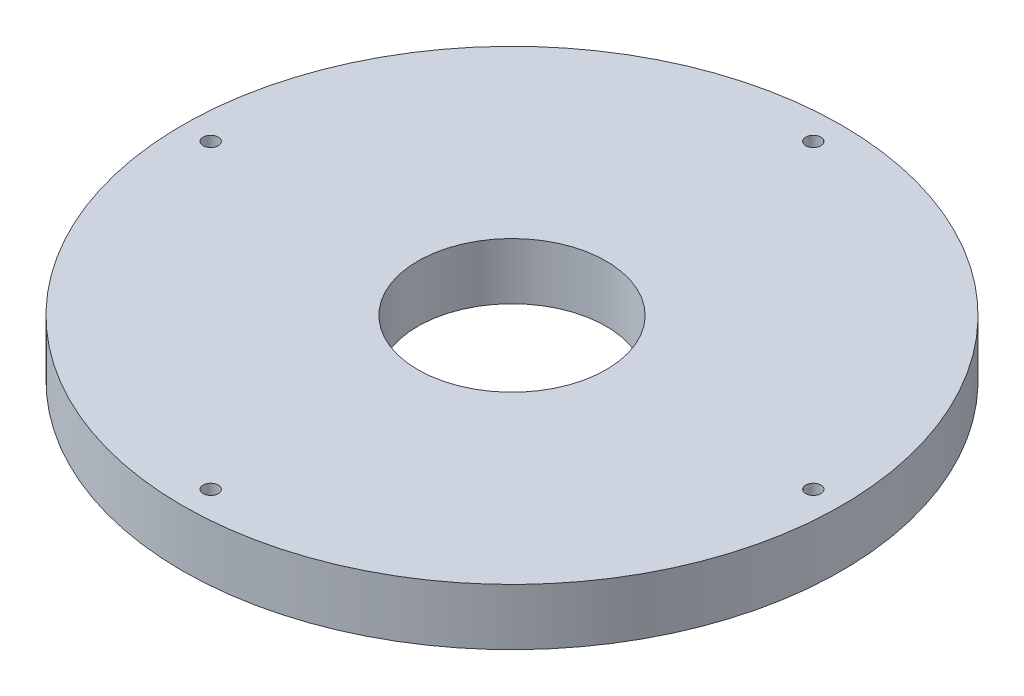
ISO-10303-21;
HEADER;
FILE_DESCRIPTION(('STEP AP214'),'2;1');
FILE_NAME('part.step','',(''),(''),'','','');
FILE_SCHEMA(('AUTOMOTIVE_DESIGN { 1 0 10303 214 1 1 1 1 }'));
ENDSEC;
DATA;
#1=APPLICATION_CONTEXT('core data for automotive mechanical design processes');
#2=APPLICATION_PROTOCOL_DEFINITION('international standard','automotive_design',2000,#1);
#3=PRODUCT_CONTEXT('',#1,'mechanical');
#4=PRODUCT('Part','Part','',(#3));
#5=PRODUCT_RELATED_PRODUCT_CATEGORY('part','',(#4));
#6=PRODUCT_DEFINITION_FORMATION('','',#4);
#7=PRODUCT_DEFINITION_CONTEXT('part definition',#1,'design');
#8=PRODUCT_DEFINITION('design','',#6,#7);
#9=PRODUCT_DEFINITION_SHAPE('','',#8);
#10=(LENGTH_UNIT() NAMED_UNIT(*) SI_UNIT(.MILLI.,.METRE.));
#11=(NAMED_UNIT(*) PLANE_ANGLE_UNIT() SI_UNIT($,.RADIAN.));
#12=(NAMED_UNIT(*) SI_UNIT($,.STERADIAN.) SOLID_ANGLE_UNIT());
#13=UNCERTAINTY_MEASURE_WITH_UNIT(LENGTH_MEASURE(1.E-05),#10,'distance_accuracy_value','');
#14=(GEOMETRIC_REPRESENTATION_CONTEXT(3) GLOBAL_UNCERTAINTY_ASSIGNED_CONTEXT((#13)) GLOBAL_UNIT_ASSIGNED_CONTEXT((#10,
#11,#12)) REPRESENTATION_CONTEXT('',''));
#15=CARTESIAN_POINT('',(0.,0.,0.));
#16=DIRECTION('',(0.,0.,1.));
#17=DIRECTION('',(1.,0.,0.));
#18=AXIS2_PLACEMENT_3D('',#15,#16,#17);
#19=CARTESIAN_POINT('',(0.,15.,0.));
#20=DIRECTION('',(0.,-1.,0.));
#21=DIRECTION('',(0.,0.,-1.));
#22=AXIS2_PLACEMENT_3D('',#19,#20,#21);
#23=CYLINDRICAL_SURFACE('',#22,175.);
#24=CARTESIAN_POINT('',(0.,15.,0.));
#25=DIRECTION('',(0.,1.,0.));
#26=DIRECTION('',(0.,0.,1.));
#27=AXIS2_PLACEMENT_3D('',#24,#25,#26);
#28=CIRCLE('',#27,175.);
#29=CARTESIAN_POINT('',(0.,15.,175.));
#30=VERTEX_POINT('',#29);
#31=EDGE_CURVE('E10',#30,#30,#28,.T.);
#32=ORIENTED_EDGE('',*,*,#31,.F.);
#33=EDGE_LOOP('',(#32));
#34=FACE_BOUND('',#33,.T.);
#35=CARTESIAN_POINT('',(0.,-15.,0.));
#36=DIRECTION('',(0.,1.,0.));
#37=DIRECTION('',(0.,0.,1.));
#38=AXIS2_PLACEMENT_3D('',#35,#36,#37);
#39=CIRCLE('',#38,175.);
#40=CARTESIAN_POINT('',(0.,-15.,175.));
#41=VERTEX_POINT('',#40);
#42=EDGE_CURVE('E40',#41,#41,#39,.T.);
#43=ORIENTED_EDGE('',*,*,#42,.T.);
#44=EDGE_LOOP('',(#43));
#45=FACE_BOUND('',#44,.T.);
#46=ADVANCED_FACE('F37',(#34,#45),#23,.T.);
#47=CARTESIAN_POINT('',(0.,15.,0.));
#48=DIRECTION('',(0.,1.,0.));
#49=DIRECTION('',(0.,0.,1.));
#50=AXIS2_PLACEMENT_3D('',#47,#48,#49);
#51=PLANE('',#50);
#52=CARTESIAN_POINT('',(0.,15.,-160.));
#53=DIRECTION('',(0.,1.,0.));
#54=DIRECTION('',(0.,0.,1.));
#55=AXIS2_PLACEMENT_3D('',#52,#53,#54);
#56=CIRCLE('',#55,4.);
#57=CARTESIAN_POINT('',(0.,15.,-156.));
#58=VERTEX_POINT('',#57);
#59=EDGE_CURVE('E68',#58,#58,#56,.T.);
#60=ORIENTED_EDGE('',*,*,#59,.F.);
#61=EDGE_LOOP('',(#60));
#62=FACE_BOUND('',#61,.T.);
#63=CARTESIAN_POINT('',(0.,15.,0.));
#64=DIRECTION('',(0.,1.,0.));
#65=DIRECTION('',(0.,0.,1.));
#66=AXIS2_PLACEMENT_3D('',#63,#64,#65);
#67=CIRCLE('',#66,50.);
#68=CARTESIAN_POINT('',(0.,15.,50.));
#69=VERTEX_POINT('',#68);
#70=EDGE_CURVE('E69',#69,#69,#67,.T.);
#71=ORIENTED_EDGE('',*,*,#70,.F.);
#72=EDGE_LOOP('',(#71));
#73=FACE_BOUND('',#72,.T.);
#74=CARTESIAN_POINT('',(160.,15.,-8.88178419700125E-13));
#75=DIRECTION('',(0.,1.,0.));
#76=DIRECTION('',(0.,0.,-1.));
#77=AXIS2_PLACEMENT_3D('',#74,#75,#76);
#78=CIRCLE('',#77,3.99999999999999);
#79=CARTESIAN_POINT('',(160.,15.,-4.00000000000088));
#80=VERTEX_POINT('',#79);
#81=EDGE_CURVE('E77',#80,#80,#78,.T.);
#82=ORIENTED_EDGE('',*,*,#81,.F.);
#83=EDGE_LOOP('',(#82));
#84=FACE_BOUND('',#83,.T.);
#85=CARTESIAN_POINT('',(-160.,15.,0.));
#86=DIRECTION('',(0.,1.,0.));
#87=DIRECTION('',(0.,0.,1.));
#88=AXIS2_PLACEMENT_3D('',#85,#86,#87);
#89=CIRCLE('',#88,3.99999999999999);
#90=CARTESIAN_POINT('',(-160.,15.,3.99999999999999));
#91=VERTEX_POINT('',#90);
#92=EDGE_CURVE('E51',#91,#91,#89,.T.);
#93=ORIENTED_EDGE('',*,*,#92,.F.);
#94=EDGE_LOOP('',(#93));
#95=FACE_BOUND('',#94,.T.);
#96=CARTESIAN_POINT('',(0.,15.,160.));
#97=DIRECTION('',(0.,1.,0.));
#98=DIRECTION('',(0.,0.,-1.));
#99=AXIS2_PLACEMENT_3D('',#96,#97,#98);
#100=CIRCLE('',#99,4.);
#101=CARTESIAN_POINT('',(0.,15.,156.));
#102=VERTEX_POINT('',#101);
#103=EDGE_CURVE('E60',#102,#102,#100,.T.);
#104=ORIENTED_EDGE('',*,*,#103,.F.);
#105=EDGE_LOOP('',(#104));
#106=FACE_BOUND('',#105,.T.);
#107=ORIENTED_EDGE('',*,*,#31,.T.);
#108=EDGE_LOOP('',(#107));
#109=FACE_BOUND('',#108,.T.);
#110=ADVANCED_FACE('F101',(#62,#73,#84,#95,#106,#109),#51,.T.);
#111=CARTESIAN_POINT('',(0.,-15.,0.));
#112=DIRECTION('',(0.,1.,0.));
#113=DIRECTION('',(0.,0.,1.));
#114=AXIS2_PLACEMENT_3D('',#111,#112,#113);
#115=PLANE('',#114);
#116=CARTESIAN_POINT('',(0.,-15.,-160.));
#117=DIRECTION('',(0.,1.,0.));
#118=DIRECTION('',(0.,0.,1.));
#119=AXIS2_PLACEMENT_3D('',#116,#117,#118);
#120=CIRCLE('',#119,4.);
#121=CARTESIAN_POINT('',(0.,-15.,-156.));
#122=VERTEX_POINT('',#121);
#123=EDGE_CURVE('E49',#122,#122,#120,.T.);
#124=ORIENTED_EDGE('',*,*,#123,.T.);
#125=EDGE_LOOP('',(#124));
#126=FACE_BOUND('',#125,.T.);
#127=CARTESIAN_POINT('',(0.,-15.,0.));
#128=DIRECTION('',(0.,1.,0.));
#129=DIRECTION('',(0.,0.,1.));
#130=AXIS2_PLACEMENT_3D('',#127,#128,#129);
#131=CIRCLE('',#130,50.);
#132=CARTESIAN_POINT('',(0.,-15.,50.));
#133=VERTEX_POINT('',#132);
#134=EDGE_CURVE('E73',#133,#133,#131,.T.);
#135=ORIENTED_EDGE('',*,*,#134,.T.);
#136=EDGE_LOOP('',(#135));
#137=FACE_BOUND('',#136,.T.);
#138=CARTESIAN_POINT('',(160.,-15.,-8.88178419700125E-13));
#139=DIRECTION('',(0.,1.,0.));
#140=DIRECTION('',(0.,0.,-1.));
#141=AXIS2_PLACEMENT_3D('',#138,#139,#140);
#142=CIRCLE('',#141,3.99999999999999);
#143=CARTESIAN_POINT('',(160.,-15.,-4.00000000000088));
#144=VERTEX_POINT('',#143);
#145=EDGE_CURVE('E56',#144,#144,#142,.T.);
#146=ORIENTED_EDGE('',*,*,#145,.T.);
#147=EDGE_LOOP('',(#146));
#148=FACE_BOUND('',#147,.T.);
#149=CARTESIAN_POINT('',(-160.,-15.,0.));
#150=DIRECTION('',(0.,1.,0.));
#151=DIRECTION('',(0.,0.,1.));
#152=AXIS2_PLACEMENT_3D('',#149,#150,#151);
#153=CIRCLE('',#152,3.99999999999999);
#154=CARTESIAN_POINT('',(-160.,-15.,3.99999999999999));
#155=VERTEX_POINT('',#154);
#156=EDGE_CURVE('E55',#155,#155,#153,.T.);
#157=ORIENTED_EDGE('',*,*,#156,.T.);
#158=EDGE_LOOP('',(#157));
#159=FACE_BOUND('',#158,.T.);
#160=CARTESIAN_POINT('',(0.,-15.,160.));
#161=DIRECTION('',(0.,1.,0.));
#162=DIRECTION('',(0.,0.,-1.));
#163=AXIS2_PLACEMENT_3D('',#160,#161,#162);
#164=CIRCLE('',#163,4.);
#165=CARTESIAN_POINT('',(0.,-15.,156.));
#166=VERTEX_POINT('',#165);
#167=EDGE_CURVE('E64',#166,#166,#164,.T.);
#168=ORIENTED_EDGE('',*,*,#167,.T.);
#169=EDGE_LOOP('',(#168));
#170=FACE_BOUND('',#169,.T.);
#171=ORIENTED_EDGE('',*,*,#42,.F.);
#172=EDGE_LOOP('',(#171));
#173=FACE_BOUND('',#172,.T.);
#174=ADVANCED_FACE('F91',(#126,#137,#148,#159,#170,#173),#115,.F.);
#175=CARTESIAN_POINT('',(0.,-15.,160.));
#176=DIRECTION('',(0.,1.,0.));
#177=DIRECTION('',(0.,0.,1.));
#178=AXIS2_PLACEMENT_3D('',#175,#176,#177);
#179=CYLINDRICAL_SURFACE('',#178,4.);
#180=ORIENTED_EDGE('',*,*,#167,.F.);
#181=EDGE_LOOP('',(#180));
#182=FACE_BOUND('',#181,.T.);
#183=ORIENTED_EDGE('',*,*,#103,.T.);
#184=EDGE_LOOP('',(#183));
#185=FACE_BOUND('',#184,.T.);
#186=ADVANCED_FACE('F113',(#182,#185),#179,.F.);
#187=CARTESIAN_POINT('',(-160.,-15.,0.));
#188=DIRECTION('',(0.,1.,0.));
#189=DIRECTION('',(0.,0.,1.));
#190=AXIS2_PLACEMENT_3D('',#187,#188,#189);
#191=CYLINDRICAL_SURFACE('',#190,3.99999999999999);
#192=ORIENTED_EDGE('',*,*,#156,.F.);
#193=EDGE_LOOP('',(#192));
#194=FACE_BOUND('',#193,.T.);
#195=ORIENTED_EDGE('',*,*,#92,.T.);
#196=EDGE_LOOP('',(#195));
#197=FACE_BOUND('',#196,.T.);
#198=ADVANCED_FACE('F115',(#194,#197),#191,.F.);
#199=CARTESIAN_POINT('',(160.,-15.,-8.88178419700125E-13));
#200=DIRECTION('',(0.,1.,0.));
#201=DIRECTION('',(0.,0.,1.));
#202=AXIS2_PLACEMENT_3D('',#199,#200,#201);
#203=CYLINDRICAL_SURFACE('',#202,3.99999999999999);
#204=ORIENTED_EDGE('',*,*,#145,.F.);
#205=EDGE_LOOP('',(#204));
#206=FACE_BOUND('',#205,.T.);
#207=ORIENTED_EDGE('',*,*,#81,.T.);
#208=EDGE_LOOP('',(#207));
#209=FACE_BOUND('',#208,.T.);
#210=ADVANCED_FACE('F122',(#206,#209),#203,.F.);
#211=CARTESIAN_POINT('',(0.,-15.,0.));
#212=DIRECTION('',(0.,1.,0.));
#213=DIRECTION('',(0.,0.,1.));
#214=AXIS2_PLACEMENT_3D('',#211,#212,#213);
#215=CYLINDRICAL_SURFACE('',#214,50.);
#216=ORIENTED_EDGE('',*,*,#134,.F.);
#217=EDGE_LOOP('',(#216));
#218=FACE_BOUND('',#217,.T.);
#219=ORIENTED_EDGE('',*,*,#70,.T.);
#220=EDGE_LOOP('',(#219));
#221=FACE_BOUND('',#220,.T.);
#222=ADVANCED_FACE('F97',(#218,#221),#215,.F.);
#223=CARTESIAN_POINT('',(0.,-15.,-160.));
#224=DIRECTION('',(0.,1.,0.));
#225=DIRECTION('',(0.,0.,1.));
#226=AXIS2_PLACEMENT_3D('',#223,#224,#225);
#227=CYLINDRICAL_SURFACE('',#226,4.);
#228=ORIENTED_EDGE('',*,*,#123,.F.);
#229=EDGE_LOOP('',(#228));
#230=FACE_BOUND('',#229,.T.);
#231=ORIENTED_EDGE('',*,*,#59,.T.);
#232=EDGE_LOOP('',(#231));
#233=FACE_BOUND('',#232,.T.);
#234=ADVANCED_FACE('F94',(#230,#233),#227,.F.);
#235=CLOSED_SHELL('',(#46,#110,#174,#186,#198,#210,#222,#234));
#236=MANIFOLD_SOLID_BREP('B2',#235);
#237=ADVANCED_BREP_SHAPE_REPRESENTATION('',(#18,#236),#14);
#238=SHAPE_DEFINITION_REPRESENTATION(#9,#237);
ENDSEC;
END-ISO-10303-21;
